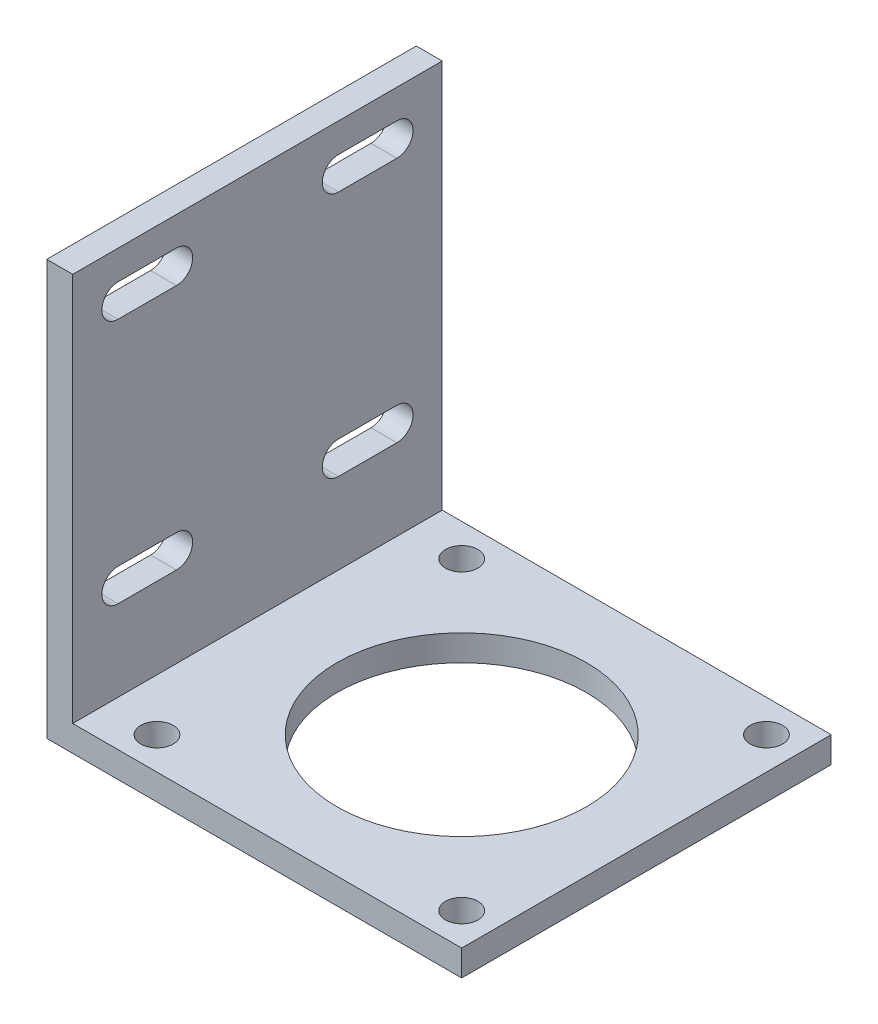
ISO-10303-21;
HEADER;
FILE_DESCRIPTION(('STEP AP214'),'2;1');
FILE_NAME('part.step','',(''),(''),'','','');
FILE_SCHEMA(('AUTOMOTIVE_DESIGN { 1 0 10303 214 1 1 1 1 }'));
ENDSEC;
DATA;
#1=APPLICATION_CONTEXT('core data for automotive mechanical design processes');
#2=APPLICATION_PROTOCOL_DEFINITION('international standard','automotive_design',2000,#1);
#3=PRODUCT_CONTEXT('',#1,'mechanical');
#4=PRODUCT('Part','Part','',(#3));
#5=PRODUCT_RELATED_PRODUCT_CATEGORY('part','',(#4));
#6=PRODUCT_DEFINITION_FORMATION('','',#4);
#7=PRODUCT_DEFINITION_CONTEXT('part definition',#1,'design');
#8=PRODUCT_DEFINITION('design','',#6,#7);
#9=PRODUCT_DEFINITION_SHAPE('','',#8);
#10=(LENGTH_UNIT() NAMED_UNIT(*) SI_UNIT(.MILLI.,.METRE.));
#11=(NAMED_UNIT(*) PLANE_ANGLE_UNIT() SI_UNIT($,.RADIAN.));
#12=(NAMED_UNIT(*) SI_UNIT($,.STERADIAN.) SOLID_ANGLE_UNIT());
#13=UNCERTAINTY_MEASURE_WITH_UNIT(LENGTH_MEASURE(1.E-05),#10,'distance_accuracy_value','');
#14=(GEOMETRIC_REPRESENTATION_CONTEXT(3) GLOBAL_UNCERTAINTY_ASSIGNED_CONTEXT((#13)) GLOBAL_UNIT_ASSIGNED_CONTEXT((#10,
#11,#12)) REPRESENTATION_CONTEXT('',''));
#15=CARTESIAN_POINT('',(0.,0.,0.));
#16=DIRECTION('',(0.,0.,1.));
#17=DIRECTION('',(1.,0.,0.));
#18=AXIS2_PLACEMENT_3D('',#15,#16,#17);
#19=CARTESIAN_POINT('',(32.,4.,-28.5));
#20=DIRECTION('',(-1.,0.,0.));
#21=DIRECTION('',(0.,0.,1.));
#22=AXIS2_PLACEMENT_3D('',#19,#20,#21);
#23=PLANE('',#22);
#24=DIRECTION('',(0.,0.,-1.));
#25=VECTOR('',#24,1.);
#26=CARTESIAN_POINT('',(32.,0.,-28.5));
#27=LINE('',#26,#25);
#28=CARTESIAN_POINT('',(32.,0.,28.5));
#29=VERTEX_POINT('',#28);
#30=CARTESIAN_POINT('',(32.,0.,-28.5));
#31=VERTEX_POINT('',#30);
#32=EDGE_CURVE('E327',#29,#31,#27,.T.);
#33=ORIENTED_EDGE('',*,*,#32,.T.);
#34=DIRECTION('',(0.,-1.,0.));
#35=VECTOR('',#34,1.);
#36=CARTESIAN_POINT('',(32.,4.,-28.5));
#37=LINE('',#36,#35);
#38=CARTESIAN_POINT('',(32.,4.,-28.5));
#39=VERTEX_POINT('',#38);
#40=EDGE_CURVE('E336',#39,#31,#37,.T.);
#41=ORIENTED_EDGE('',*,*,#40,.F.);
#42=DIRECTION('',(0.,0.,-1.));
#43=VECTOR('',#42,1.);
#44=CARTESIAN_POINT('',(32.,4.,-28.5));
#45=LINE('',#44,#43);
#46=CARTESIAN_POINT('',(32.,4.,28.5));
#47=VERTEX_POINT('',#46);
#48=EDGE_CURVE('E311',#47,#39,#45,.T.);
#49=ORIENTED_EDGE('',*,*,#48,.F.);
#50=DIRECTION('',(0.,-1.,0.));
#51=VECTOR('',#50,1.);
#52=CARTESIAN_POINT('',(32.,4.,28.5));
#53=LINE('',#52,#51);
#54=EDGE_CURVE('E406',#47,#29,#53,.T.);
#55=ORIENTED_EDGE('',*,*,#54,.T.);
#56=EDGE_LOOP('',(#33,#41,#49,#55));
#57=FACE_BOUND('',#56,.T.);
#58=ADVANCED_FACE('F33',(#57),#23,.F.);
#59=CARTESIAN_POINT('',(-32.,4.,-28.5));
#60=DIRECTION('',(0.,0.,1.));
#61=DIRECTION('',(1.,0.,0.));
#62=AXIS2_PLACEMENT_3D('',#59,#60,#61);
#63=PLANE('',#62);
#64=DIRECTION('',(-1.,0.,0.));
#65=VECTOR('',#64,1.);
#66=CARTESIAN_POINT('',(-32.,0.,-28.5));
#67=LINE('',#66,#65);
#68=CARTESIAN_POINT('',(-32.,0.,-28.5));
#69=VERTEX_POINT('',#68);
#70=EDGE_CURVE('E409',#31,#69,#67,.T.);
#71=ORIENTED_EDGE('',*,*,#70,.T.);
#72=DIRECTION('',(0.,-1.,0.));
#73=VECTOR('',#72,1.);
#74=CARTESIAN_POINT('',(-32.,4.,-28.5));
#75=LINE('',#74,#73);
#76=CARTESIAN_POINT('',(-32.,64.,-28.5));
#77=VERTEX_POINT('',#76);
#78=EDGE_CURVE('E422',#77,#69,#75,.T.);
#79=ORIENTED_EDGE('',*,*,#78,.F.);
#80=DIRECTION('',(-1.,0.,0.));
#81=VECTOR('',#80,1.);
#82=CARTESIAN_POINT('',(-32.,64.,-28.5));
#83=LINE('',#82,#81);
#84=CARTESIAN_POINT('',(-28.,64.,-28.5));
#85=VERTEX_POINT('',#84);
#86=EDGE_CURVE('E305',#85,#77,#83,.T.);
#87=ORIENTED_EDGE('',*,*,#86,.F.);
#88=DIRECTION('',(0.,-1.,0.));
#89=VECTOR('',#88,1.);
#90=CARTESIAN_POINT('',(-28.,64.,-28.5));
#91=LINE('',#90,#89);
#92=CARTESIAN_POINT('',(-28.,4.,-28.5));
#93=VERTEX_POINT('',#92);
#94=EDGE_CURVE('E308',#85,#93,#91,.T.);
#95=ORIENTED_EDGE('',*,*,#94,.T.);
#96=DIRECTION('',(-1.,0.,0.));
#97=VECTOR('',#96,1.);
#98=CARTESIAN_POINT('',(-32.,4.,-28.5));
#99=LINE('',#98,#97);
#100=EDGE_CURVE('E425',#39,#93,#99,.T.);
#101=ORIENTED_EDGE('',*,*,#100,.F.);
#102=ORIENTED_EDGE('',*,*,#40,.T.);
#103=EDGE_LOOP('',(#71,#79,#87,#95,#101,#102));
#104=FACE_BOUND('',#103,.T.);
#105=ADVANCED_FACE('F393',(#104),#63,.F.);
#106=CARTESIAN_POINT('',(-32.,4.,-28.5));
#107=DIRECTION('',(1.,0.,0.));
#108=DIRECTION('',(0.,0.,-1.));
#109=AXIS2_PLACEMENT_3D('',#106,#107,#108);
#110=PLANE('',#109);
#111=DIRECTION('',(0.,0.,1.));
#112=VECTOR('',#111,1.);
#113=CARTESIAN_POINT('',(-32.,54.5,12.5));
#114=LINE('',#113,#112);
#115=CARTESIAN_POINT('',(-32.,54.5,12.5));
#116=VERTEX_POINT('',#115);
#117=CARTESIAN_POINT('',(-32.,54.5,21.5));
#118=VERTEX_POINT('',#117);
#119=EDGE_CURVE('E193',#116,#118,#114,.T.);
#120=ORIENTED_EDGE('',*,*,#119,.F.);
#121=CARTESIAN_POINT('',(-32.,57.,12.5));
#122=DIRECTION('',(-1.,0.,0.));
#123=DIRECTION('',(0.,0.,-1.));
#124=AXIS2_PLACEMENT_3D('',#121,#122,#123);
#125=CIRCLE('',#124,2.5);
#126=CARTESIAN_POINT('',(-32.,59.5,12.5));
#127=VERTEX_POINT('',#126);
#128=EDGE_CURVE('E47',#127,#116,#125,.T.);
#129=ORIENTED_EDGE('',*,*,#128,.F.);
#130=DIRECTION('',(0.,0.,-1.));
#131=VECTOR('',#130,1.);
#132=CARTESIAN_POINT('',(-32.,59.5,12.5));
#133=LINE('',#132,#131);
#134=CARTESIAN_POINT('',(-32.,59.5,21.5));
#135=VERTEX_POINT('',#134);
#136=EDGE_CURVE('E200',#135,#127,#133,.T.);
#137=ORIENTED_EDGE('',*,*,#136,.F.);
#138=CARTESIAN_POINT('',(-32.,57.,21.5));
#139=DIRECTION('',(-1.,0.,0.));
#140=DIRECTION('',(0.,0.,1.));
#141=AXIS2_PLACEMENT_3D('',#138,#139,#140);
#142=CIRCLE('',#141,2.5);
#143=EDGE_CURVE('E184',#118,#135,#142,.T.);
#144=ORIENTED_EDGE('',*,*,#143,.F.);
#145=EDGE_LOOP('',(#120,#129,#137,#144));
#146=FACE_BOUND('',#145,.T.);
#147=DIRECTION('',(0.,0.,1.));
#148=VECTOR('',#147,1.);
#149=CARTESIAN_POINT('',(-32.,54.5,-21.5));
#150=LINE('',#149,#148);
#151=CARTESIAN_POINT('',(-32.,54.5,-21.5));
#152=VERTEX_POINT('',#151);
#153=CARTESIAN_POINT('',(-32.,54.5,-12.5));
#154=VERTEX_POINT('',#153);
#155=EDGE_CURVE('E211',#152,#154,#150,.T.);
#156=ORIENTED_EDGE('',*,*,#155,.F.);
#157=CARTESIAN_POINT('',(-32.,57.,-21.5));
#158=DIRECTION('',(-1.,0.,0.));
#159=DIRECTION('',(0.,0.,-1.));
#160=AXIS2_PLACEMENT_3D('',#157,#158,#159);
#161=CIRCLE('',#160,2.5);
#162=CARTESIAN_POINT('',(-32.,59.5,-21.5));
#163=VERTEX_POINT('',#162);
#164=EDGE_CURVE('E207',#163,#152,#161,.T.);
#165=ORIENTED_EDGE('',*,*,#164,.F.);
#166=DIRECTION('',(0.,0.,-1.));
#167=VECTOR('',#166,1.);
#168=CARTESIAN_POINT('',(-32.,59.5,-21.5));
#169=LINE('',#168,#167);
#170=CARTESIAN_POINT('',(-32.,59.5,-12.5));
#171=VERTEX_POINT('',#170);
#172=EDGE_CURVE('E217',#171,#163,#169,.T.);
#173=ORIENTED_EDGE('',*,*,#172,.F.);
#174=CARTESIAN_POINT('',(-32.,57.,-12.5));
#175=DIRECTION('',(-1.,0.,0.));
#176=DIRECTION('',(0.,0.,1.));
#177=AXIS2_PLACEMENT_3D('',#174,#175,#176);
#178=CIRCLE('',#177,2.5);
#179=EDGE_CURVE('E214',#154,#171,#178,.T.);
#180=ORIENTED_EDGE('',*,*,#179,.F.);
#181=EDGE_LOOP('',(#156,#165,#173,#180));
#182=FACE_BOUND('',#181,.T.);
#183=DIRECTION('',(0.,0.,1.));
#184=VECTOR('',#183,1.);
#185=CARTESIAN_POINT('',(-32.,16.5,12.5));
#186=LINE('',#185,#184);
#187=CARTESIAN_POINT('',(-32.,16.5,12.5));
#188=VERTEX_POINT('',#187);
#189=CARTESIAN_POINT('',(-32.,16.5,21.5));
#190=VERTEX_POINT('',#189);
#191=EDGE_CURVE('E231',#188,#190,#186,.T.);
#192=ORIENTED_EDGE('',*,*,#191,.F.);
#193=CARTESIAN_POINT('',(-32.,19.,12.5));
#194=DIRECTION('',(-1.,0.,0.));
#195=DIRECTION('',(0.,0.,-1.));
#196=AXIS2_PLACEMENT_3D('',#193,#194,#195);
#197=CIRCLE('',#196,2.5);
#198=CARTESIAN_POINT('',(-32.,21.5,12.5));
#199=VERTEX_POINT('',#198);
#200=EDGE_CURVE('E223',#199,#188,#197,.T.);
#201=ORIENTED_EDGE('',*,*,#200,.F.);
#202=DIRECTION('',(0.,0.,-1.));
#203=VECTOR('',#202,1.);
#204=CARTESIAN_POINT('',(-32.,21.5,12.5));
#205=LINE('',#204,#203);
#206=CARTESIAN_POINT('',(-32.,21.5,21.5));
#207=VERTEX_POINT('',#206);
#208=EDGE_CURVE('E237',#207,#199,#205,.T.);
#209=ORIENTED_EDGE('',*,*,#208,.F.);
#210=CARTESIAN_POINT('',(-32.,19.,21.5));
#211=DIRECTION('',(-1.,0.,0.));
#212=DIRECTION('',(0.,0.,1.));
#213=AXIS2_PLACEMENT_3D('',#210,#211,#212);
#214=CIRCLE('',#213,2.5);
#215=EDGE_CURVE('E234',#190,#207,#214,.T.);
#216=ORIENTED_EDGE('',*,*,#215,.F.);
#217=EDGE_LOOP('',(#192,#201,#209,#216));
#218=FACE_BOUND('',#217,.T.);
#219=DIRECTION('',(0.,0.,1.));
#220=VECTOR('',#219,1.);
#221=CARTESIAN_POINT('',(-32.,16.5,-21.5));
#222=LINE('',#221,#220);
#223=CARTESIAN_POINT('',(-32.,16.5,-21.5));
#224=VERTEX_POINT('',#223);
#225=CARTESIAN_POINT('',(-32.,16.5,-12.5));
#226=VERTEX_POINT('',#225);
#227=EDGE_CURVE('E251',#224,#226,#222,.T.);
#228=ORIENTED_EDGE('',*,*,#227,.F.);
#229=CARTESIAN_POINT('',(-32.,19.,-21.5));
#230=DIRECTION('',(-1.,0.,0.));
#231=DIRECTION('',(0.,0.,-1.));
#232=AXIS2_PLACEMENT_3D('',#229,#230,#231);
#233=CIRCLE('',#232,2.5);
#234=CARTESIAN_POINT('',(-32.,21.5,-21.5));
#235=VERTEX_POINT('',#234);
#236=EDGE_CURVE('E243',#235,#224,#233,.T.);
#237=ORIENTED_EDGE('',*,*,#236,.F.);
#238=DIRECTION('',(0.,0.,-1.));
#239=VECTOR('',#238,1.);
#240=CARTESIAN_POINT('',(-32.,21.5,-21.5));
#241=LINE('',#240,#239);
#242=CARTESIAN_POINT('',(-32.,21.5,-12.5));
#243=VERTEX_POINT('',#242);
#244=EDGE_CURVE('E257',#243,#235,#241,.T.);
#245=ORIENTED_EDGE('',*,*,#244,.F.);
#246=CARTESIAN_POINT('',(-32.,19.,-12.5));
#247=DIRECTION('',(-1.,0.,0.));
#248=DIRECTION('',(0.,0.,1.));
#249=AXIS2_PLACEMENT_3D('',#246,#247,#248);
#250=CIRCLE('',#249,2.5);
#251=EDGE_CURVE('E254',#226,#243,#250,.T.);
#252=ORIENTED_EDGE('',*,*,#251,.F.);
#253=EDGE_LOOP('',(#228,#237,#245,#252));
#254=FACE_BOUND('',#253,.T.);
#255=DIRECTION('',(0.,0.,1.));
#256=VECTOR('',#255,1.);
#257=CARTESIAN_POINT('',(-32.,0.,-28.5));
#258=LINE('',#257,#256);
#259=CARTESIAN_POINT('',(-32.,0.,28.5));
#260=VERTEX_POINT('',#259);
#261=EDGE_CURVE('E411',#69,#260,#258,.T.);
#262=ORIENTED_EDGE('',*,*,#261,.T.);
#263=DIRECTION('',(0.,-1.,0.));
#264=VECTOR('',#263,1.);
#265=CARTESIAN_POINT('',(-32.,4.,28.5));
#266=LINE('',#265,#264);
#267=CARTESIAN_POINT('',(-32.,64.,28.5));
#268=VERTEX_POINT('',#267);
#269=EDGE_CURVE('E419',#268,#260,#266,.T.);
#270=ORIENTED_EDGE('',*,*,#269,.F.);
#271=DIRECTION('',(0.,0.,1.));
#272=VECTOR('',#271,1.);
#273=CARTESIAN_POINT('',(-32.,64.,-28.5));
#274=LINE('',#273,#272);
#275=EDGE_CURVE('E298',#77,#268,#274,.T.);
#276=ORIENTED_EDGE('',*,*,#275,.F.);
#277=ORIENTED_EDGE('',*,*,#78,.T.);
#278=EDGE_LOOP('',(#262,#270,#276,#277));
#279=FACE_BOUND('',#278,.T.);
#280=ADVANCED_FACE('F197',(#146,#182,#218,#254,#279),#110,.F.);
#281=CARTESIAN_POINT('',(-32.,4.,28.5));
#282=DIRECTION('',(0.,0.,-1.));
#283=DIRECTION('',(-1.,0.,0.));
#284=AXIS2_PLACEMENT_3D('',#281,#282,#283);
#285=PLANE('',#284);
#286=DIRECTION('',(1.,0.,0.));
#287=VECTOR('',#286,1.);
#288=CARTESIAN_POINT('',(-32.,0.,28.5));
#289=LINE('',#288,#287);
#290=EDGE_CURVE('E416',#260,#29,#289,.T.);
#291=ORIENTED_EDGE('',*,*,#290,.T.);
#292=ORIENTED_EDGE('',*,*,#54,.F.);
#293=DIRECTION('',(1.,0.,0.));
#294=VECTOR('',#293,1.);
#295=CARTESIAN_POINT('',(-32.,4.,28.5));
#296=LINE('',#295,#294);
#297=CARTESIAN_POINT('',(-28.,4.,28.5));
#298=VERTEX_POINT('',#297);
#299=EDGE_CURVE('E317',#298,#47,#296,.T.);
#300=ORIENTED_EDGE('',*,*,#299,.F.);
#301=DIRECTION('',(0.,-1.,0.));
#302=VECTOR('',#301,1.);
#303=CARTESIAN_POINT('',(-28.,64.,28.5));
#304=LINE('',#303,#302);
#305=CARTESIAN_POINT('',(-28.,64.,28.5));
#306=VERTEX_POINT('',#305);
#307=EDGE_CURVE('E322',#306,#298,#304,.T.);
#308=ORIENTED_EDGE('',*,*,#307,.F.);
#309=DIRECTION('',(1.,0.,0.));
#310=VECTOR('',#309,1.);
#311=CARTESIAN_POINT('',(-32.,64.,28.5));
#312=LINE('',#311,#310);
#313=EDGE_CURVE('E301',#268,#306,#312,.T.);
#314=ORIENTED_EDGE('',*,*,#313,.F.);
#315=ORIENTED_EDGE('',*,*,#269,.T.);
#316=EDGE_LOOP('',(#291,#292,#300,#308,#314,#315));
#317=FACE_BOUND('',#316,.T.);
#318=ADVANCED_FACE('F433',(#317),#285,.F.);
#319=CARTESIAN_POINT('',(0.,4.,0.));
#320=DIRECTION('',(0.,1.,0.));
#321=DIRECTION('',(0.,0.,1.));
#322=AXIS2_PLACEMENT_3D('',#319,#320,#321);
#323=PLANE('',#322);
#324=CARTESIAN_POINT('',(27.,4.,23.5));
#325=DIRECTION('',(0.,1.,0.));
#326=DIRECTION('',(0.,0.,1.));
#327=AXIS2_PLACEMENT_3D('',#324,#325,#326);
#328=CIRCLE('',#327,2.49999999999999);
#329=CARTESIAN_POINT('',(27.,4.,26.));
#330=VERTEX_POINT('',#329);
#331=EDGE_CURVE('E272',#330,#330,#328,.T.);
#332=ORIENTED_EDGE('',*,*,#331,.F.);
#333=EDGE_LOOP('',(#332));
#334=FACE_BOUND('',#333,.T.);
#335=CARTESIAN_POINT('',(27.,4.,-23.5));
#336=DIRECTION('',(0.,1.,0.));
#337=DIRECTION('',(0.,0.,1.));
#338=AXIS2_PLACEMENT_3D('',#335,#336,#337);
#339=CIRCLE('',#338,2.49999999999999);
#340=CARTESIAN_POINT('',(27.,4.,-21.));
#341=VERTEX_POINT('',#340);
#342=EDGE_CURVE('E278',#341,#341,#339,.T.);
#343=ORIENTED_EDGE('',*,*,#342,.F.);
#344=EDGE_LOOP('',(#343));
#345=FACE_BOUND('',#344,.T.);
#346=CARTESIAN_POINT('',(-20.,4.,-23.5));
#347=DIRECTION('',(0.,1.,0.));
#348=DIRECTION('',(0.,0.,1.));
#349=AXIS2_PLACEMENT_3D('',#346,#347,#348);
#350=CIRCLE('',#349,2.49999999999999);
#351=CARTESIAN_POINT('',(-20.,4.,-21.));
#352=VERTEX_POINT('',#351);
#353=EDGE_CURVE('E284',#352,#352,#350,.T.);
#354=ORIENTED_EDGE('',*,*,#353,.F.);
#355=EDGE_LOOP('',(#354));
#356=FACE_BOUND('',#355,.T.);
#357=CARTESIAN_POINT('',(-20.,4.,23.5));
#358=DIRECTION('',(0.,1.,0.));
#359=DIRECTION('',(0.,0.,1.));
#360=AXIS2_PLACEMENT_3D('',#357,#358,#359);
#361=CIRCLE('',#360,2.49999999999999);
#362=CARTESIAN_POINT('',(-20.,4.,26.));
#363=VERTEX_POINT('',#362);
#364=EDGE_CURVE('E290',#363,#363,#361,.T.);
#365=ORIENTED_EDGE('',*,*,#364,.F.);
#366=EDGE_LOOP('',(#365));
#367=FACE_BOUND('',#366,.T.);
#368=CARTESIAN_POINT('',(3.50000000000001,4.,0.));
#369=DIRECTION('',(0.,1.,0.));
#370=DIRECTION('',(0.,0.,1.));
#371=AXIS2_PLACEMENT_3D('',#368,#369,#370);
#372=CIRCLE('',#371,19.25);
#373=CARTESIAN_POINT('',(3.50000000000001,4.,19.25));
#374=VERTEX_POINT('',#373);
#375=EDGE_CURVE('E294',#374,#374,#372,.T.);
#376=ORIENTED_EDGE('',*,*,#375,.F.);
#377=EDGE_LOOP('',(#376));
#378=FACE_BOUND('',#377,.T.);
#379=DIRECTION('',(0.,0.,-1.));
#380=VECTOR('',#379,1.);
#381=CARTESIAN_POINT('',(-28.,4.,-28.5));
#382=LINE('',#381,#380);
#383=EDGE_CURVE('E297',#298,#93,#382,.T.);
#384=ORIENTED_EDGE('',*,*,#383,.F.);
#385=ORIENTED_EDGE('',*,*,#299,.T.);
#386=ORIENTED_EDGE('',*,*,#48,.T.);
#387=ORIENTED_EDGE('',*,*,#100,.T.);
#388=EDGE_LOOP('',(#384,#385,#386,#387));
#389=FACE_BOUND('',#388,.T.);
#390=ADVANCED_FACE('F429',(#334,#345,#356,#367,#378,#389),#323,.T.);
#391=CARTESIAN_POINT('',(0.,0.,0.));
#392=DIRECTION('',(0.,1.,0.));
#393=DIRECTION('',(0.,0.,1.));
#394=AXIS2_PLACEMENT_3D('',#391,#392,#393);
#395=PLANE('',#394);
#396=CARTESIAN_POINT('',(27.,0.,23.5));
#397=DIRECTION('',(0.,-1.,0.));
#398=DIRECTION('',(0.,0.,-1.));
#399=AXIS2_PLACEMENT_3D('',#396,#397,#398);
#400=CIRCLE('',#399,2.49999999999999);
#401=CARTESIAN_POINT('',(27.,0.,21.));
#402=VERTEX_POINT('',#401);
#403=EDGE_CURVE('E263',#402,#402,#400,.T.);
#404=ORIENTED_EDGE('',*,*,#403,.F.);
#405=EDGE_LOOP('',(#404));
#406=FACE_BOUND('',#405,.T.);
#407=CARTESIAN_POINT('',(27.,0.,-23.5));
#408=DIRECTION('',(0.,-1.,0.));
#409=DIRECTION('',(0.,0.,-1.));
#410=AXIS2_PLACEMENT_3D('',#407,#408,#409);
#411=CIRCLE('',#410,2.49999999999999);
#412=CARTESIAN_POINT('',(27.,0.,-26.));
#413=VERTEX_POINT('',#412);
#414=EDGE_CURVE('E275',#413,#413,#411,.T.);
#415=ORIENTED_EDGE('',*,*,#414,.F.);
#416=EDGE_LOOP('',(#415));
#417=FACE_BOUND('',#416,.T.);
#418=CARTESIAN_POINT('',(-20.,0.,-23.5));
#419=DIRECTION('',(0.,-1.,0.));
#420=DIRECTION('',(0.,0.,-1.));
#421=AXIS2_PLACEMENT_3D('',#418,#419,#420);
#422=CIRCLE('',#421,2.49999999999999);
#423=CARTESIAN_POINT('',(-20.,0.,-26.));
#424=VERTEX_POINT('',#423);
#425=EDGE_CURVE('E281',#424,#424,#422,.T.);
#426=ORIENTED_EDGE('',*,*,#425,.F.);
#427=EDGE_LOOP('',(#426));
#428=FACE_BOUND('',#427,.T.);
#429=CARTESIAN_POINT('',(-20.,0.,23.5));
#430=DIRECTION('',(0.,-1.,0.));
#431=DIRECTION('',(0.,0.,-1.));
#432=AXIS2_PLACEMENT_3D('',#429,#430,#431);
#433=CIRCLE('',#432,2.49999999999999);
#434=CARTESIAN_POINT('',(-20.,0.,21.));
#435=VERTEX_POINT('',#434);
#436=EDGE_CURVE('E287',#435,#435,#433,.T.);
#437=ORIENTED_EDGE('',*,*,#436,.F.);
#438=EDGE_LOOP('',(#437));
#439=FACE_BOUND('',#438,.T.);
#440=CARTESIAN_POINT('',(3.50000000000001,0.,0.));
#441=DIRECTION('',(0.,-1.,0.));
#442=DIRECTION('',(0.,0.,-1.));
#443=AXIS2_PLACEMENT_3D('',#440,#441,#442);
#444=CIRCLE('',#443,19.25);
#445=CARTESIAN_POINT('',(3.50000000000001,0.,-19.25));
#446=VERTEX_POINT('',#445);
#447=EDGE_CURVE('E291',#446,#446,#444,.T.);
#448=ORIENTED_EDGE('',*,*,#447,.F.);
#449=EDGE_LOOP('',(#448));
#450=FACE_BOUND('',#449,.T.);
#451=ORIENTED_EDGE('',*,*,#32,.F.);
#452=ORIENTED_EDGE('',*,*,#290,.F.);
#453=ORIENTED_EDGE('',*,*,#261,.F.);
#454=ORIENTED_EDGE('',*,*,#70,.F.);
#455=EDGE_LOOP('',(#451,#452,#453,#454));
#456=FACE_BOUND('',#455,.T.);
#457=ADVANCED_FACE('F436',(#406,#417,#428,#439,#450,#456),#395,.F.);
#458=CARTESIAN_POINT('',(-28.,64.,-28.5));
#459=DIRECTION('',(-1.,0.,0.));
#460=DIRECTION('',(0.,0.,1.));
#461=AXIS2_PLACEMENT_3D('',#458,#459,#460);
#462=PLANE('',#461);
#463=DIRECTION('',(0.,0.,-1.));
#464=VECTOR('',#463,1.);
#465=CARTESIAN_POINT('',(-28.,59.5,-28.5));
#466=LINE('',#465,#464);
#467=CARTESIAN_POINT('',(-28.,59.5,21.5));
#468=VERTEX_POINT('',#467);
#469=CARTESIAN_POINT('',(-28.,59.5,12.5));
#470=VERTEX_POINT('',#469);
#471=EDGE_CURVE('E40',#468,#470,#466,.T.);
#472=ORIENTED_EDGE('',*,*,#471,.T.);
#473=CARTESIAN_POINT('',(-28.,57.,12.5));
#474=DIRECTION('',(-1.,0.,0.));
#475=DIRECTION('',(0.,0.,1.));
#476=AXIS2_PLACEMENT_3D('',#473,#474,#475);
#477=CIRCLE('',#476,2.5);
#478=CARTESIAN_POINT('',(-28.,54.5,12.5));
#479=VERTEX_POINT('',#478);
#480=EDGE_CURVE('E11',#470,#479,#477,.T.);
#481=ORIENTED_EDGE('',*,*,#480,.T.);
#482=DIRECTION('',(0.,0.,1.));
#483=VECTOR('',#482,1.);
#484=CARTESIAN_POINT('',(-28.,54.5,-28.5));
#485=LINE('',#484,#483);
#486=CARTESIAN_POINT('',(-28.,54.5,21.5));
#487=VERTEX_POINT('',#486);
#488=EDGE_CURVE('E369',#479,#487,#485,.T.);
#489=ORIENTED_EDGE('',*,*,#488,.T.);
#490=CARTESIAN_POINT('',(-28.,57.,21.5));
#491=DIRECTION('',(-1.,0.,0.));
#492=DIRECTION('',(0.,0.,1.));
#493=AXIS2_PLACEMENT_3D('',#490,#491,#492);
#494=CIRCLE('',#493,2.5);
#495=EDGE_CURVE('E187',#487,#468,#494,.T.);
#496=ORIENTED_EDGE('',*,*,#495,.T.);
#497=EDGE_LOOP('',(#472,#481,#489,#496));
#498=FACE_BOUND('',#497,.T.);
#499=DIRECTION('',(0.,0.,-1.));
#500=VECTOR('',#499,1.);
#501=CARTESIAN_POINT('',(-28.,59.5,-28.5));
#502=LINE('',#501,#500);
#503=CARTESIAN_POINT('',(-28.,59.5,-12.5));
#504=VERTEX_POINT('',#503);
#505=CARTESIAN_POINT('',(-28.,59.5,-21.5));
#506=VERTEX_POINT('',#505);
#507=EDGE_CURVE('E363',#504,#506,#502,.T.);
#508=ORIENTED_EDGE('',*,*,#507,.T.);
#509=CARTESIAN_POINT('',(-28.,57.,-21.5));
#510=DIRECTION('',(-1.,0.,0.));
#511=DIRECTION('',(0.,0.,1.));
#512=AXIS2_PLACEMENT_3D('',#509,#510,#511);
#513=CIRCLE('',#512,2.5);
#514=CARTESIAN_POINT('',(-28.,54.5,-21.5));
#515=VERTEX_POINT('',#514);
#516=EDGE_CURVE('E366',#506,#515,#513,.T.);
#517=ORIENTED_EDGE('',*,*,#516,.T.);
#518=DIRECTION('',(0.,0.,1.));
#519=VECTOR('',#518,1.);
#520=CARTESIAN_POINT('',(-28.,54.5,-28.5));
#521=LINE('',#520,#519);
#522=CARTESIAN_POINT('',(-28.,54.5,-12.5));
#523=VERTEX_POINT('',#522);
#524=EDGE_CURVE('E357',#515,#523,#521,.T.);
#525=ORIENTED_EDGE('',*,*,#524,.T.);
#526=CARTESIAN_POINT('',(-28.,57.,-12.5));
#527=DIRECTION('',(-1.,0.,0.));
#528=DIRECTION('',(0.,0.,1.));
#529=AXIS2_PLACEMENT_3D('',#526,#527,#528);
#530=CIRCLE('',#529,2.5);
#531=EDGE_CURVE('E360',#523,#504,#530,.T.);
#532=ORIENTED_EDGE('',*,*,#531,.T.);
#533=EDGE_LOOP('',(#508,#517,#525,#532));
#534=FACE_BOUND('',#533,.T.);
#535=DIRECTION('',(0.,0.,-1.));
#536=VECTOR('',#535,1.);
#537=CARTESIAN_POINT('',(-28.,21.5,-28.5));
#538=LINE('',#537,#536);
#539=CARTESIAN_POINT('',(-28.,21.5,21.5));
#540=VERTEX_POINT('',#539);
#541=CARTESIAN_POINT('',(-28.,21.5,12.5));
#542=VERTEX_POINT('',#541);
#543=EDGE_CURVE('E351',#540,#542,#538,.T.);
#544=ORIENTED_EDGE('',*,*,#543,.T.);
#545=CARTESIAN_POINT('',(-28.,19.,12.5));
#546=DIRECTION('',(-1.,0.,0.));
#547=DIRECTION('',(0.,0.,1.));
#548=AXIS2_PLACEMENT_3D('',#545,#546,#547);
#549=CIRCLE('',#548,2.5);
#550=CARTESIAN_POINT('',(-28.,16.5,12.5));
#551=VERTEX_POINT('',#550);
#552=EDGE_CURVE('E354',#542,#551,#549,.T.);
#553=ORIENTED_EDGE('',*,*,#552,.T.);
#554=DIRECTION('',(0.,0.,1.));
#555=VECTOR('',#554,1.);
#556=CARTESIAN_POINT('',(-28.,16.5,-28.5));
#557=LINE('',#556,#555);
#558=CARTESIAN_POINT('',(-28.,16.5,21.5));
#559=VERTEX_POINT('',#558);
#560=EDGE_CURVE('E345',#551,#559,#557,.T.);
#561=ORIENTED_EDGE('',*,*,#560,.T.);
#562=CARTESIAN_POINT('',(-28.,19.,21.5));
#563=DIRECTION('',(-1.,0.,0.));
#564=DIRECTION('',(0.,0.,1.));
#565=AXIS2_PLACEMENT_3D('',#562,#563,#564);
#566=CIRCLE('',#565,2.5);
#567=EDGE_CURVE('E348',#559,#540,#566,.T.);
#568=ORIENTED_EDGE('',*,*,#567,.T.);
#569=EDGE_LOOP('',(#544,#553,#561,#568));
#570=FACE_BOUND('',#569,.T.);
#571=DIRECTION('',(0.,0.,-1.));
#572=VECTOR('',#571,1.);
#573=CARTESIAN_POINT('',(-28.,21.5,-28.5));
#574=LINE('',#573,#572);
#575=CARTESIAN_POINT('',(-28.,21.5,-12.5));
#576=VERTEX_POINT('',#575);
#577=CARTESIAN_POINT('',(-28.,21.5,-21.5));
#578=VERTEX_POINT('',#577);
#579=EDGE_CURVE('E339',#576,#578,#574,.T.);
#580=ORIENTED_EDGE('',*,*,#579,.T.);
#581=CARTESIAN_POINT('',(-28.,19.,-21.5));
#582=DIRECTION('',(-1.,0.,0.));
#583=DIRECTION('',(0.,0.,1.));
#584=AXIS2_PLACEMENT_3D('',#581,#582,#583);
#585=CIRCLE('',#584,2.5);
#586=CARTESIAN_POINT('',(-28.,16.5,-21.5));
#587=VERTEX_POINT('',#586);
#588=EDGE_CURVE('E342',#578,#587,#585,.T.);
#589=ORIENTED_EDGE('',*,*,#588,.T.);
#590=DIRECTION('',(0.,0.,1.));
#591=VECTOR('',#590,1.);
#592=CARTESIAN_POINT('',(-28.,16.5,-28.5));
#593=LINE('',#592,#591);
#594=CARTESIAN_POINT('',(-28.,16.5,-12.5));
#595=VERTEX_POINT('',#594);
#596=EDGE_CURVE('E332',#587,#595,#593,.T.);
#597=ORIENTED_EDGE('',*,*,#596,.T.);
#598=CARTESIAN_POINT('',(-28.,19.,-12.5));
#599=DIRECTION('',(-1.,0.,0.));
#600=DIRECTION('',(0.,0.,1.));
#601=AXIS2_PLACEMENT_3D('',#598,#599,#600);
#602=CIRCLE('',#601,2.5);
#603=EDGE_CURVE('E335',#595,#576,#602,.T.);
#604=ORIENTED_EDGE('',*,*,#603,.T.);
#605=EDGE_LOOP('',(#580,#589,#597,#604));
#606=FACE_BOUND('',#605,.T.);
#607=ORIENTED_EDGE('',*,*,#383,.T.);
#608=ORIENTED_EDGE('',*,*,#94,.F.);
#609=DIRECTION('',(0.,0.,-1.));
#610=VECTOR('',#609,1.);
#611=CARTESIAN_POINT('',(-28.,64.,-28.5));
#612=LINE('',#611,#610);
#613=EDGE_CURVE('E303',#306,#85,#612,.T.);
#614=ORIENTED_EDGE('',*,*,#613,.F.);
#615=ORIENTED_EDGE('',*,*,#307,.T.);
#616=EDGE_LOOP('',(#607,#608,#614,#615));
#617=FACE_BOUND('',#616,.T.);
#618=ADVANCED_FACE('F373',(#498,#534,#570,#606,#617),#462,.F.);
#619=CARTESIAN_POINT('',(0.,64.,0.));
#620=DIRECTION('',(0.,1.,0.));
#621=DIRECTION('',(0.,0.,1.));
#622=AXIS2_PLACEMENT_3D('',#619,#620,#621);
#623=PLANE('',#622);
#624=ORIENTED_EDGE('',*,*,#275,.T.);
#625=ORIENTED_EDGE('',*,*,#313,.T.);
#626=ORIENTED_EDGE('',*,*,#613,.T.);
#627=ORIENTED_EDGE('',*,*,#86,.T.);
#628=EDGE_LOOP('',(#624,#625,#626,#627));
#629=FACE_BOUND('',#628,.T.);
#630=ADVANCED_FACE('F441',(#629),#623,.T.);
#631=CARTESIAN_POINT('',(3.50000000000001,60.,0.));
#632=DIRECTION('',(0.,-1.,0.));
#633=DIRECTION('',(0.,0.,-1.));
#634=AXIS2_PLACEMENT_3D('',#631,#632,#633);
#635=CYLINDRICAL_SURFACE('',#634,19.25);
#636=ORIENTED_EDGE('',*,*,#375,.T.);
#637=EDGE_LOOP('',(#636));
#638=FACE_BOUND('',#637,.T.);
#639=ORIENTED_EDGE('',*,*,#447,.T.);
#640=EDGE_LOOP('',(#639));
#641=FACE_BOUND('',#640,.T.);
#642=ADVANCED_FACE('F451',(#638,#641),#635,.F.);
#643=CARTESIAN_POINT('',(-20.,0.,23.5));
#644=DIRECTION('',(0.,-1.,0.));
#645=DIRECTION('',(0.,0.,-1.));
#646=AXIS2_PLACEMENT_3D('',#643,#644,#645);
#647=CYLINDRICAL_SURFACE('',#646,2.49999999999999);
#648=ORIENTED_EDGE('',*,*,#364,.T.);
#649=EDGE_LOOP('',(#648));
#650=FACE_BOUND('',#649,.T.);
#651=ORIENTED_EDGE('',*,*,#436,.T.);
#652=EDGE_LOOP('',(#651));
#653=FACE_BOUND('',#652,.T.);
#654=ADVANCED_FACE('F488',(#650,#653),#647,.F.);
#655=CARTESIAN_POINT('',(-20.,0.,-23.5));
#656=DIRECTION('',(0.,-1.,0.));
#657=DIRECTION('',(0.,0.,-1.));
#658=AXIS2_PLACEMENT_3D('',#655,#656,#657);
#659=CYLINDRICAL_SURFACE('',#658,2.49999999999999);
#660=ORIENTED_EDGE('',*,*,#353,.T.);
#661=EDGE_LOOP('',(#660));
#662=FACE_BOUND('',#661,.T.);
#663=ORIENTED_EDGE('',*,*,#425,.T.);
#664=EDGE_LOOP('',(#663));
#665=FACE_BOUND('',#664,.T.);
#666=ADVANCED_FACE('F493',(#662,#665),#659,.F.);
#667=CARTESIAN_POINT('',(27.,0.,-23.5));
#668=DIRECTION('',(0.,-1.,0.));
#669=DIRECTION('',(0.,0.,-1.));
#670=AXIS2_PLACEMENT_3D('',#667,#668,#669);
#671=CYLINDRICAL_SURFACE('',#670,2.49999999999999);
#672=ORIENTED_EDGE('',*,*,#342,.T.);
#673=EDGE_LOOP('',(#672));
#674=FACE_BOUND('',#673,.T.);
#675=ORIENTED_EDGE('',*,*,#414,.T.);
#676=EDGE_LOOP('',(#675));
#677=FACE_BOUND('',#676,.T.);
#678=ADVANCED_FACE('F505',(#674,#677),#671,.F.);
#679=CARTESIAN_POINT('',(27.,0.,23.5));
#680=DIRECTION('',(0.,-1.,0.));
#681=DIRECTION('',(0.,0.,-1.));
#682=AXIS2_PLACEMENT_3D('',#679,#680,#681);
#683=CYLINDRICAL_SURFACE('',#682,2.49999999999999);
#684=ORIENTED_EDGE('',*,*,#331,.T.);
#685=EDGE_LOOP('',(#684));
#686=FACE_BOUND('',#685,.T.);
#687=ORIENTED_EDGE('',*,*,#403,.T.);
#688=EDGE_LOOP('',(#687));
#689=FACE_BOUND('',#688,.T.);
#690=ADVANCED_FACE('F514',(#686,#689),#683,.F.);
#691=CARTESIAN_POINT('',(28.,19.,-21.5));
#692=DIRECTION('',(-1.,0.,0.));
#693=DIRECTION('',(0.,0.,1.));
#694=AXIS2_PLACEMENT_3D('',#691,#692,#693);
#695=CYLINDRICAL_SURFACE('',#694,2.5);
#696=DIRECTION('',(-1.,0.,0.));
#697=VECTOR('',#696,1.);
#698=CARTESIAN_POINT('',(28.,21.5,-21.5));
#699=LINE('',#698,#697);
#700=EDGE_CURVE('E261',#578,#235,#699,.T.);
#701=ORIENTED_EDGE('',*,*,#700,.T.);
#702=ORIENTED_EDGE('',*,*,#236,.T.);
#703=DIRECTION('',(-1.,0.,0.));
#704=VECTOR('',#703,1.);
#705=CARTESIAN_POINT('',(28.,16.5,-21.5));
#706=LINE('',#705,#704);
#707=EDGE_CURVE('E260',#587,#224,#706,.T.);
#708=ORIENTED_EDGE('',*,*,#707,.F.);
#709=ORIENTED_EDGE('',*,*,#588,.F.);
#710=EDGE_LOOP('',(#701,#702,#708,#709));
#711=FACE_BOUND('',#710,.T.);
#712=ADVANCED_FACE('F523',(#711),#695,.F.);
#713=CARTESIAN_POINT('',(28.,21.5,-21.5));
#714=DIRECTION('',(0.,1.,0.));
#715=DIRECTION('',(0.,0.,1.));
#716=AXIS2_PLACEMENT_3D('',#713,#714,#715);
#717=PLANE('',#716);
#718=DIRECTION('',(-1.,0.,0.));
#719=VECTOR('',#718,1.);
#720=CARTESIAN_POINT('',(28.,21.5,-12.5));
#721=LINE('',#720,#719);
#722=EDGE_CURVE('E264',#576,#243,#721,.T.);
#723=ORIENTED_EDGE('',*,*,#722,.T.);
#724=ORIENTED_EDGE('',*,*,#244,.T.);
#725=ORIENTED_EDGE('',*,*,#700,.F.);
#726=ORIENTED_EDGE('',*,*,#579,.F.);
#727=EDGE_LOOP('',(#723,#724,#725,#726));
#728=FACE_BOUND('',#727,.T.);
#729=ADVANCED_FACE('F534',(#728),#717,.F.);
#730=CARTESIAN_POINT('',(28.,19.,-12.5));
#731=DIRECTION('',(-1.,0.,0.));
#732=DIRECTION('',(0.,0.,1.));
#733=AXIS2_PLACEMENT_3D('',#730,#731,#732);
#734=CYLINDRICAL_SURFACE('',#733,2.5);
#735=DIRECTION('',(-1.,0.,0.));
#736=VECTOR('',#735,1.);
#737=CARTESIAN_POINT('',(28.,16.5,-12.5));
#738=LINE('',#737,#736);
#739=EDGE_CURVE('E266',#595,#226,#738,.T.);
#740=ORIENTED_EDGE('',*,*,#739,.T.);
#741=ORIENTED_EDGE('',*,*,#251,.T.);
#742=ORIENTED_EDGE('',*,*,#722,.F.);
#743=ORIENTED_EDGE('',*,*,#603,.F.);
#744=EDGE_LOOP('',(#740,#741,#742,#743));
#745=FACE_BOUND('',#744,.T.);
#746=ADVANCED_FACE('F541',(#745),#734,.F.);
#747=CARTESIAN_POINT('',(28.,16.5,-21.5));
#748=DIRECTION('',(0.,-1.,0.));
#749=DIRECTION('',(0.,0.,-1.));
#750=AXIS2_PLACEMENT_3D('',#747,#748,#749);
#751=PLANE('',#750);
#752=ORIENTED_EDGE('',*,*,#707,.T.);
#753=ORIENTED_EDGE('',*,*,#227,.T.);
#754=ORIENTED_EDGE('',*,*,#739,.F.);
#755=ORIENTED_EDGE('',*,*,#596,.F.);
#756=EDGE_LOOP('',(#752,#753,#754,#755));
#757=FACE_BOUND('',#756,.T.);
#758=ADVANCED_FACE('F549',(#757),#751,.F.);
#759=CARTESIAN_POINT('',(28.,19.,12.5));
#760=DIRECTION('',(-1.,0.,0.));
#761=DIRECTION('',(0.,0.,1.));
#762=AXIS2_PLACEMENT_3D('',#759,#760,#761);
#763=CYLINDRICAL_SURFACE('',#762,2.5);
#764=DIRECTION('',(-1.,0.,0.));
#765=VECTOR('',#764,1.);
#766=CARTESIAN_POINT('',(28.,21.5,12.5));
#767=LINE('',#766,#765);
#768=EDGE_CURVE('E241',#542,#199,#767,.T.);
#769=ORIENTED_EDGE('',*,*,#768,.T.);
#770=ORIENTED_EDGE('',*,*,#200,.T.);
#771=DIRECTION('',(-1.,0.,0.));
#772=VECTOR('',#771,1.);
#773=CARTESIAN_POINT('',(28.,16.5,12.5));
#774=LINE('',#773,#772);
#775=EDGE_CURVE('E240',#551,#188,#774,.T.);
#776=ORIENTED_EDGE('',*,*,#775,.F.);
#777=ORIENTED_EDGE('',*,*,#552,.F.);
#778=EDGE_LOOP('',(#769,#770,#776,#777));
#779=FACE_BOUND('',#778,.T.);
#780=ADVANCED_FACE('F557',(#779),#763,.F.);
#781=CARTESIAN_POINT('',(28.,21.5,12.5));
#782=DIRECTION('',(0.,1.,0.));
#783=DIRECTION('',(0.,0.,1.));
#784=AXIS2_PLACEMENT_3D('',#781,#782,#783);
#785=PLANE('',#784);
#786=DIRECTION('',(-1.,0.,0.));
#787=VECTOR('',#786,1.);
#788=CARTESIAN_POINT('',(28.,21.5,21.5));
#789=LINE('',#788,#787);
#790=EDGE_CURVE('E244',#540,#207,#789,.T.);
#791=ORIENTED_EDGE('',*,*,#790,.T.);
#792=ORIENTED_EDGE('',*,*,#208,.T.);
#793=ORIENTED_EDGE('',*,*,#768,.F.);
#794=ORIENTED_EDGE('',*,*,#543,.F.);
#795=EDGE_LOOP('',(#791,#792,#793,#794));
#796=FACE_BOUND('',#795,.T.);
#797=ADVANCED_FACE('F565',(#796),#785,.F.);
#798=CARTESIAN_POINT('',(28.,19.,21.5));
#799=DIRECTION('',(-1.,0.,0.));
#800=DIRECTION('',(0.,0.,1.));
#801=AXIS2_PLACEMENT_3D('',#798,#799,#800);
#802=CYLINDRICAL_SURFACE('',#801,2.5);
#803=DIRECTION('',(-1.,0.,0.));
#804=VECTOR('',#803,1.);
#805=CARTESIAN_POINT('',(28.,16.5,21.5));
#806=LINE('',#805,#804);
#807=EDGE_CURVE('E246',#559,#190,#806,.T.);
#808=ORIENTED_EDGE('',*,*,#807,.T.);
#809=ORIENTED_EDGE('',*,*,#215,.T.);
#810=ORIENTED_EDGE('',*,*,#790,.F.);
#811=ORIENTED_EDGE('',*,*,#567,.F.);
#812=EDGE_LOOP('',(#808,#809,#810,#811));
#813=FACE_BOUND('',#812,.T.);
#814=ADVANCED_FACE('F573',(#813),#802,.F.);
#815=CARTESIAN_POINT('',(28.,16.5,12.5));
#816=DIRECTION('',(0.,-1.,0.));
#817=DIRECTION('',(0.,0.,-1.));
#818=AXIS2_PLACEMENT_3D('',#815,#816,#817);
#819=PLANE('',#818);
#820=ORIENTED_EDGE('',*,*,#775,.T.);
#821=ORIENTED_EDGE('',*,*,#191,.T.);
#822=ORIENTED_EDGE('',*,*,#807,.F.);
#823=ORIENTED_EDGE('',*,*,#560,.F.);
#824=EDGE_LOOP('',(#820,#821,#822,#823));
#825=FACE_BOUND('',#824,.T.);
#826=ADVANCED_FACE('F581',(#825),#819,.F.);
#827=CARTESIAN_POINT('',(28.,57.,-21.5));
#828=DIRECTION('',(-1.,0.,0.));
#829=DIRECTION('',(0.,0.,1.));
#830=AXIS2_PLACEMENT_3D('',#827,#828,#829);
#831=CYLINDRICAL_SURFACE('',#830,2.5);
#832=DIRECTION('',(-1.,0.,0.));
#833=VECTOR('',#832,1.);
#834=CARTESIAN_POINT('',(28.,59.5,-21.5));
#835=LINE('',#834,#833);
#836=EDGE_CURVE('E221',#506,#163,#835,.T.);
#837=ORIENTED_EDGE('',*,*,#836,.T.);
#838=ORIENTED_EDGE('',*,*,#164,.T.);
#839=DIRECTION('',(-1.,0.,0.));
#840=VECTOR('',#839,1.);
#841=CARTESIAN_POINT('',(28.,54.5,-21.5));
#842=LINE('',#841,#840);
#843=EDGE_CURVE('E220',#515,#152,#842,.T.);
#844=ORIENTED_EDGE('',*,*,#843,.F.);
#845=ORIENTED_EDGE('',*,*,#516,.F.);
#846=EDGE_LOOP('',(#837,#838,#844,#845));
#847=FACE_BOUND('',#846,.T.);
#848=ADVANCED_FACE('F589',(#847),#831,.F.);
#849=CARTESIAN_POINT('',(28.,59.5,-21.5));
#850=DIRECTION('',(0.,1.,0.));
#851=DIRECTION('',(0.,0.,1.));
#852=AXIS2_PLACEMENT_3D('',#849,#850,#851);
#853=PLANE('',#852);
#854=DIRECTION('',(-1.,0.,0.));
#855=VECTOR('',#854,1.);
#856=CARTESIAN_POINT('',(28.,59.5,-12.5));
#857=LINE('',#856,#855);
#858=EDGE_CURVE('E224',#504,#171,#857,.T.);
#859=ORIENTED_EDGE('',*,*,#858,.T.);
#860=ORIENTED_EDGE('',*,*,#172,.T.);
#861=ORIENTED_EDGE('',*,*,#836,.F.);
#862=ORIENTED_EDGE('',*,*,#507,.F.);
#863=EDGE_LOOP('',(#859,#860,#861,#862));
#864=FACE_BOUND('',#863,.T.);
#865=ADVANCED_FACE('F597',(#864),#853,.F.);
#866=CARTESIAN_POINT('',(28.,57.,-12.5));
#867=DIRECTION('',(-1.,0.,0.));
#868=DIRECTION('',(0.,0.,1.));
#869=AXIS2_PLACEMENT_3D('',#866,#867,#868);
#870=CYLINDRICAL_SURFACE('',#869,2.5);
#871=DIRECTION('',(-1.,0.,0.));
#872=VECTOR('',#871,1.);
#873=CARTESIAN_POINT('',(28.,54.5,-12.5));
#874=LINE('',#873,#872);
#875=EDGE_CURVE('E226',#523,#154,#874,.T.);
#876=ORIENTED_EDGE('',*,*,#875,.T.);
#877=ORIENTED_EDGE('',*,*,#179,.T.);
#878=ORIENTED_EDGE('',*,*,#858,.F.);
#879=ORIENTED_EDGE('',*,*,#531,.F.);
#880=EDGE_LOOP('',(#876,#877,#878,#879));
#881=FACE_BOUND('',#880,.T.);
#882=ADVANCED_FACE('F387',(#881),#870,.F.);
#883=CARTESIAN_POINT('',(28.,54.5,-21.5));
#884=DIRECTION('',(0.,-1.,0.));
#885=DIRECTION('',(0.,0.,-1.));
#886=AXIS2_PLACEMENT_3D('',#883,#884,#885);
#887=PLANE('',#886);
#888=ORIENTED_EDGE('',*,*,#843,.T.);
#889=ORIENTED_EDGE('',*,*,#155,.T.);
#890=ORIENTED_EDGE('',*,*,#875,.F.);
#891=ORIENTED_EDGE('',*,*,#524,.F.);
#892=EDGE_LOOP('',(#888,#889,#890,#891));
#893=FACE_BOUND('',#892,.T.);
#894=ADVANCED_FACE('F380',(#893),#887,.F.);
#895=CARTESIAN_POINT('',(28.,57.,12.5));
#896=DIRECTION('',(-1.,0.,0.));
#897=DIRECTION('',(0.,0.,1.));
#898=AXIS2_PLACEMENT_3D('',#895,#896,#897);
#899=CYLINDRICAL_SURFACE('',#898,2.5);
#900=DIRECTION('',(-1.,0.,0.));
#901=VECTOR('',#900,1.);
#902=CARTESIAN_POINT('',(28.,59.5,12.5));
#903=LINE('',#902,#901);
#904=EDGE_CURVE('E205',#470,#127,#903,.T.);
#905=ORIENTED_EDGE('',*,*,#904,.T.);
#906=ORIENTED_EDGE('',*,*,#128,.T.);
#907=DIRECTION('',(-1.,0.,0.));
#908=VECTOR('',#907,1.);
#909=CARTESIAN_POINT('',(28.,54.5,12.5));
#910=LINE('',#909,#908);
#911=EDGE_CURVE('E190',#479,#116,#910,.T.);
#912=ORIENTED_EDGE('',*,*,#911,.F.);
#913=ORIENTED_EDGE('',*,*,#480,.F.);
#914=EDGE_LOOP('',(#905,#906,#912,#913));
#915=FACE_BOUND('',#914,.T.);
#916=ADVANCED_FACE('F378',(#915),#899,.F.);
#917=CARTESIAN_POINT('',(28.,59.5,12.5));
#918=DIRECTION('',(0.,1.,0.));
#919=DIRECTION('',(0.,0.,1.));
#920=AXIS2_PLACEMENT_3D('',#917,#918,#919);
#921=PLANE('',#920);
#922=DIRECTION('',(-1.,0.,0.));
#923=VECTOR('',#922,1.);
#924=CARTESIAN_POINT('',(28.,59.5,21.5));
#925=LINE('',#924,#923);
#926=EDGE_CURVE('E189',#468,#135,#925,.T.);
#927=ORIENTED_EDGE('',*,*,#926,.T.);
#928=ORIENTED_EDGE('',*,*,#136,.T.);
#929=ORIENTED_EDGE('',*,*,#904,.F.);
#930=ORIENTED_EDGE('',*,*,#471,.F.);
#931=EDGE_LOOP('',(#927,#928,#929,#930));
#932=FACE_BOUND('',#931,.T.);
#933=ADVANCED_FACE('F377',(#932),#921,.F.);
#934=CARTESIAN_POINT('',(28.,57.,21.5));
#935=DIRECTION('',(-1.,0.,0.));
#936=DIRECTION('',(0.,0.,1.));
#937=AXIS2_PLACEMENT_3D('',#934,#935,#936);
#938=CYLINDRICAL_SURFACE('',#937,2.5);
#939=DIRECTION('',(-1.,0.,0.));
#940=VECTOR('',#939,1.);
#941=CARTESIAN_POINT('',(28.,54.5,21.5));
#942=LINE('',#941,#940);
#943=EDGE_CURVE('E55',#487,#118,#942,.T.);
#944=ORIENTED_EDGE('',*,*,#943,.T.);
#945=ORIENTED_EDGE('',*,*,#143,.T.);
#946=ORIENTED_EDGE('',*,*,#926,.F.);
#947=ORIENTED_EDGE('',*,*,#495,.F.);
#948=EDGE_LOOP('',(#944,#945,#946,#947));
#949=FACE_BOUND('',#948,.T.);
#950=ADVANCED_FACE('F181',(#949),#938,.F.);
#951=CARTESIAN_POINT('',(28.,54.5,12.5));
#952=DIRECTION('',(0.,-1.,0.));
#953=DIRECTION('',(0.,0.,-1.));
#954=AXIS2_PLACEMENT_3D('',#951,#952,#953);
#955=PLANE('',#954);
#956=ORIENTED_EDGE('',*,*,#911,.T.);
#957=ORIENTED_EDGE('',*,*,#119,.T.);
#958=ORIENTED_EDGE('',*,*,#943,.F.);
#959=ORIENTED_EDGE('',*,*,#488,.F.);
#960=EDGE_LOOP('',(#956,#957,#958,#959));
#961=FACE_BOUND('',#960,.T.);
#962=ADVANCED_FACE('F194',(#961),#955,.F.);
#963=CLOSED_SHELL('',(#58,#105,#280,#318,#390,#457,#618,#630,#642,#654,#666,#678,#690,#712,#729,
#746,#758,#780,#797,#814,#826,#848,#865,#882,#894,#916,#933,#950,#962));
#964=MANIFOLD_SOLID_BREP('B2',#963);
#965=ADVANCED_BREP_SHAPE_REPRESENTATION('',(#18,#964),#14);
#966=SHAPE_DEFINITION_REPRESENTATION(#9,#965);
ENDSEC;
END-ISO-10303-21;
